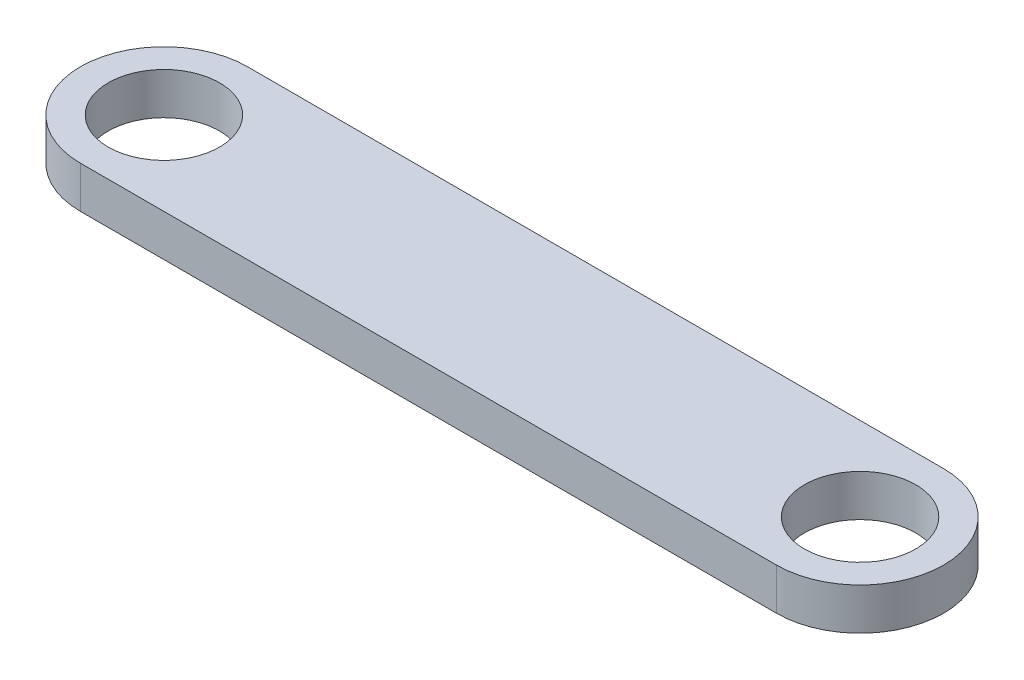
ISO-10303-21;
HEADER;
FILE_DESCRIPTION(('STEP AP214'),'2;1');
FILE_NAME('part.step','',(''),(''),'','','');
FILE_SCHEMA(('AUTOMOTIVE_DESIGN { 1 0 10303 214 1 1 1 1 }'));
ENDSEC;
DATA;
#1=APPLICATION_CONTEXT('core data for automotive mechanical design processes');
#2=APPLICATION_PROTOCOL_DEFINITION('international standard','automotive_design',2000,#1);
#3=PRODUCT_CONTEXT('',#1,'mechanical');
#4=PRODUCT('Part','Part','',(#3));
#5=PRODUCT_RELATED_PRODUCT_CATEGORY('part','',(#4));
#6=PRODUCT_DEFINITION_FORMATION('','',#4);
#7=PRODUCT_DEFINITION_CONTEXT('part definition',#1,'design');
#8=PRODUCT_DEFINITION('design','',#6,#7);
#9=PRODUCT_DEFINITION_SHAPE('','',#8);
#10=(LENGTH_UNIT() NAMED_UNIT(*) SI_UNIT(.MILLI.,.METRE.));
#11=(NAMED_UNIT(*) PLANE_ANGLE_UNIT() SI_UNIT($,.RADIAN.));
#12=(NAMED_UNIT(*) SI_UNIT($,.STERADIAN.) SOLID_ANGLE_UNIT());
#13=UNCERTAINTY_MEASURE_WITH_UNIT(LENGTH_MEASURE(1.E-05),#10,'distance_accuracy_value','');
#14=(GEOMETRIC_REPRESENTATION_CONTEXT(3) GLOBAL_UNCERTAINTY_ASSIGNED_CONTEXT((#13)) GLOBAL_UNIT_ASSIGNED_CONTEXT((#10,
#11,#12)) REPRESENTATION_CONTEXT('',''));
#15=CARTESIAN_POINT('',(0.,0.,0.));
#16=DIRECTION('',(0.,0.,1.));
#17=DIRECTION('',(1.,0.,0.));
#18=AXIS2_PLACEMENT_3D('',#15,#16,#17);
#19=CARTESIAN_POINT('',(-40.1246369495546,3.,-0.124636949554571));
#20=DIRECTION('',(0.,1.,0.));
#21=DIRECTION('',(0.,0.,1.));
#22=AXIS2_PLACEMENT_3D('',#19,#20,#21);
#23=PLANE('',#22);
#24=CARTESIAN_POINT('',(-40.1246369495546,3.,-0.124636949554571));
#25=DIRECTION('',(0.,1.,0.));
#26=DIRECTION('',(0.,0.,1.));
#27=AXIS2_PLACEMENT_3D('',#24,#25,#26);
#28=CIRCLE('',#27,4.);
#29=CARTESIAN_POINT('',(-40.1246369495546,3.,3.87536305044543));
#30=VERTEX_POINT('',#29);
#31=EDGE_CURVE('E104',#30,#30,#28,.T.);
#32=ORIENTED_EDGE('',*,*,#31,.F.);
#33=EDGE_LOOP('',(#32));
#34=FACE_BOUND('',#33,.T.);
#35=CARTESIAN_POINT('',(-40.1246369495546,3.,-0.124636949554571));
#36=DIRECTION('',(0.,1.,0.));
#37=DIRECTION('',(0.,0.,1.));
#38=AXIS2_PLACEMENT_3D('',#35,#36,#37);
#39=CIRCLE('',#38,6.);
#40=CARTESIAN_POINT('',(-40.1246369495546,3.,-6.12463694955457));
#41=VERTEX_POINT('',#40);
#42=CARTESIAN_POINT('',(-40.1246369495546,3.,5.87536305044543));
#43=VERTEX_POINT('',#42);
#44=EDGE_CURVE('E89',#41,#43,#39,.T.);
#45=ORIENTED_EDGE('',*,*,#44,.T.);
#46=DIRECTION('',(1.,0.,0.));
#47=VECTOR('',#46,1.);
#48=CARTESIAN_POINT('',(-40.1246369495546,3.,5.87536305044543));
#49=LINE('',#48,#47);
#50=CARTESIAN_POINT('',(9.87536305044545,3.,5.87536305044543));
#51=VERTEX_POINT('',#50);
#52=EDGE_CURVE('E84',#43,#51,#49,.T.);
#53=ORIENTED_EDGE('',*,*,#52,.T.);
#54=CARTESIAN_POINT('',(9.87536305044545,3.,-0.124636949554571));
#55=DIRECTION('',(0.,1.,0.));
#56=DIRECTION('',(0.,0.,1.));
#57=AXIS2_PLACEMENT_3D('',#54,#55,#56);
#58=CIRCLE('',#57,6.00000000000001);
#59=CARTESIAN_POINT('',(9.87536305044545,3.,-6.12463694955458));
#60=VERTEX_POINT('',#59);
#61=EDGE_CURVE('E87',#51,#60,#58,.T.);
#62=ORIENTED_EDGE('',*,*,#61,.T.);
#63=DIRECTION('',(-1.,0.,0.));
#64=VECTOR('',#63,1.);
#65=CARTESIAN_POINT('',(-40.1246369495546,3.,-6.12463694955457));
#66=LINE('',#65,#64);
#67=EDGE_CURVE('E54',#60,#41,#66,.T.);
#68=ORIENTED_EDGE('',*,*,#67,.T.);
#69=EDGE_LOOP('',(#45,#53,#62,#68));
#70=FACE_BOUND('',#69,.T.);
#71=CARTESIAN_POINT('',(9.87536305044545,3.,-0.124636949554571));
#72=DIRECTION('',(0.,1.,0.));
#73=DIRECTION('',(0.,0.,1.));
#74=AXIS2_PLACEMENT_3D('',#71,#72,#73);
#75=CIRCLE('',#74,4.00000000000001);
#76=CARTESIAN_POINT('',(9.87536305044545,3.,3.87536305044544));
#77=VERTEX_POINT('',#76);
#78=EDGE_CURVE('E119',#77,#77,#75,.T.);
#79=ORIENTED_EDGE('',*,*,#78,.F.);
#80=EDGE_LOOP('',(#79));
#81=FACE_BOUND('',#80,.T.);
#82=ADVANCED_FACE('F37',(#34,#70,#81),#23,.T.);
#83=CARTESIAN_POINT('',(-40.1246369495546,0.,-0.124636949554571));
#84=DIRECTION('',(0.,1.,0.));
#85=DIRECTION('',(0.,0.,1.));
#86=AXIS2_PLACEMENT_3D('',#83,#84,#85);
#87=PLANE('',#86);
#88=CARTESIAN_POINT('',(-40.1246369495546,0.,-0.124636949554571));
#89=DIRECTION('',(0.,1.,0.));
#90=DIRECTION('',(0.,0.,1.));
#91=AXIS2_PLACEMENT_3D('',#88,#89,#90);
#92=CIRCLE('',#91,6.);
#93=CARTESIAN_POINT('',(-40.1246369495546,0.,-6.12463694955457));
#94=VERTEX_POINT('',#93);
#95=CARTESIAN_POINT('',(-40.1246369495546,0.,5.87536305044543));
#96=VERTEX_POINT('',#95);
#97=EDGE_CURVE('E101',#94,#96,#92,.T.);
#98=ORIENTED_EDGE('',*,*,#97,.F.);
#99=DIRECTION('',(-1.,0.,0.));
#100=VECTOR('',#99,1.);
#101=CARTESIAN_POINT('',(-40.1246369495546,0.,-6.12463694955457));
#102=LINE('',#101,#100);
#103=CARTESIAN_POINT('',(9.87536305044545,0.,-6.12463694955458));
#104=VERTEX_POINT('',#103);
#105=EDGE_CURVE('E77',#104,#94,#102,.T.);
#106=ORIENTED_EDGE('',*,*,#105,.F.);
#107=CARTESIAN_POINT('',(9.87536305044545,0.,-0.124636949554571));
#108=DIRECTION('',(0.,1.,0.));
#109=DIRECTION('',(0.,0.,1.));
#110=AXIS2_PLACEMENT_3D('',#107,#108,#109);
#111=CIRCLE('',#110,6.00000000000001);
#112=CARTESIAN_POINT('',(9.87536305044545,0.,5.87536305044543));
#113=VERTEX_POINT('',#112);
#114=EDGE_CURVE('E71',#113,#104,#111,.T.);
#115=ORIENTED_EDGE('',*,*,#114,.F.);
#116=DIRECTION('',(1.,0.,0.));
#117=VECTOR('',#116,1.);
#118=CARTESIAN_POINT('',(-40.1246369495546,0.,5.87536305044543));
#119=LINE('',#118,#117);
#120=EDGE_CURVE('E93',#96,#113,#119,.T.);
#121=ORIENTED_EDGE('',*,*,#120,.F.);
#122=EDGE_LOOP('',(#98,#106,#115,#121));
#123=FACE_BOUND('',#122,.T.);
#124=CARTESIAN_POINT('',(-40.1246369495546,0.,-0.124636949554571));
#125=DIRECTION('',(0.,1.,0.));
#126=DIRECTION('',(0.,0.,1.));
#127=AXIS2_PLACEMENT_3D('',#124,#125,#126);
#128=CIRCLE('',#127,4.);
#129=CARTESIAN_POINT('',(-40.1246369495546,0.,3.87536305044543));
#130=VERTEX_POINT('',#129);
#131=EDGE_CURVE('E116',#130,#130,#128,.T.);
#132=ORIENTED_EDGE('',*,*,#131,.T.);
#133=EDGE_LOOP('',(#132));
#134=FACE_BOUND('',#133,.T.);
#135=CARTESIAN_POINT('',(9.87536305044545,0.,-0.124636949554571));
#136=DIRECTION('',(0.,1.,0.));
#137=DIRECTION('',(0.,0.,1.));
#138=AXIS2_PLACEMENT_3D('',#135,#136,#137);
#139=CIRCLE('',#138,4.00000000000001);
#140=CARTESIAN_POINT('',(9.87536305044545,0.,3.87536305044544));
#141=VERTEX_POINT('',#140);
#142=EDGE_CURVE('E122',#141,#141,#139,.T.);
#143=ORIENTED_EDGE('',*,*,#142,.T.);
#144=EDGE_LOOP('',(#143));
#145=FACE_BOUND('',#144,.T.);
#146=ADVANCED_FACE('F112',(#123,#134,#145),#87,.F.);
#147=CARTESIAN_POINT('',(-40.1246369495546,3.,-0.124636949554571));
#148=DIRECTION('',(0.,-1.,0.));
#149=DIRECTION('',(0.,0.,-1.));
#150=AXIS2_PLACEMENT_3D('',#147,#148,#149);
#151=CYLINDRICAL_SURFACE('',#150,6.);
#152=ORIENTED_EDGE('',*,*,#97,.T.);
#153=DIRECTION('',(0.,-1.,0.));
#154=VECTOR('',#153,1.);
#155=CARTESIAN_POINT('',(-40.1246369495546,3.,5.87536305044543));
#156=LINE('',#155,#154);
#157=EDGE_CURVE('E11',#43,#96,#156,.T.);
#158=ORIENTED_EDGE('',*,*,#157,.F.);
#159=ORIENTED_EDGE('',*,*,#44,.F.);
#160=DIRECTION('',(0.,-1.,0.));
#161=VECTOR('',#160,1.);
#162=CARTESIAN_POINT('',(-40.1246369495546,3.,-6.12463694955457));
#163=LINE('',#162,#161);
#164=EDGE_CURVE('E97',#41,#94,#163,.T.);
#165=ORIENTED_EDGE('',*,*,#164,.T.);
#166=EDGE_LOOP('',(#152,#158,#159,#165));
#167=FACE_BOUND('',#166,.T.);
#168=ADVANCED_FACE('F39',(#167),#151,.T.);
#169=CARTESIAN_POINT('',(-40.1246369495546,3.,5.87536305044543));
#170=DIRECTION('',(0.,0.,-1.));
#171=DIRECTION('',(-1.,0.,0.));
#172=AXIS2_PLACEMENT_3D('',#169,#170,#171);
#173=PLANE('',#172);
#174=ORIENTED_EDGE('',*,*,#120,.T.);
#175=DIRECTION('',(0.,-1.,0.));
#176=VECTOR('',#175,1.);
#177=CARTESIAN_POINT('',(9.87536305044545,3.,5.87536305044543));
#178=LINE('',#177,#176);
#179=EDGE_CURVE('E46',#51,#113,#178,.T.);
#180=ORIENTED_EDGE('',*,*,#179,.F.);
#181=ORIENTED_EDGE('',*,*,#52,.F.);
#182=ORIENTED_EDGE('',*,*,#157,.T.);
#183=EDGE_LOOP('',(#174,#180,#181,#182));
#184=FACE_BOUND('',#183,.T.);
#185=ADVANCED_FACE('F92',(#184),#173,.F.);
#186=CARTESIAN_POINT('',(9.87536305044545,3.,-0.124636949554571));
#187=DIRECTION('',(0.,-1.,0.));
#188=DIRECTION('',(0.,0.,-1.));
#189=AXIS2_PLACEMENT_3D('',#186,#187,#188);
#190=CYLINDRICAL_SURFACE('',#189,6.00000000000001);
#191=ORIENTED_EDGE('',*,*,#114,.T.);
#192=DIRECTION('',(0.,-1.,0.));
#193=VECTOR('',#192,1.);
#194=CARTESIAN_POINT('',(9.87536305044545,3.,-6.12463694955458));
#195=LINE('',#194,#193);
#196=EDGE_CURVE('E94',#60,#104,#195,.T.);
#197=ORIENTED_EDGE('',*,*,#196,.F.);
#198=ORIENTED_EDGE('',*,*,#61,.F.);
#199=ORIENTED_EDGE('',*,*,#179,.T.);
#200=EDGE_LOOP('',(#191,#197,#198,#199));
#201=FACE_BOUND('',#200,.T.);
#202=ADVANCED_FACE('F95',(#201),#190,.T.);
#203=CARTESIAN_POINT('',(-40.1246369495546,3.,-6.12463694955457));
#204=DIRECTION('',(0.,0.,1.));
#205=DIRECTION('',(1.,0.,0.));
#206=AXIS2_PLACEMENT_3D('',#203,#204,#205);
#207=PLANE('',#206);
#208=ORIENTED_EDGE('',*,*,#105,.T.);
#209=ORIENTED_EDGE('',*,*,#164,.F.);
#210=ORIENTED_EDGE('',*,*,#67,.F.);
#211=ORIENTED_EDGE('',*,*,#196,.T.);
#212=EDGE_LOOP('',(#208,#209,#210,#211));
#213=FACE_BOUND('',#212,.T.);
#214=ADVANCED_FACE('F109',(#213),#207,.F.);
#215=CARTESIAN_POINT('',(-40.1246369495546,3.,-0.124636949554571));
#216=DIRECTION('',(0.,-1.,0.));
#217=DIRECTION('',(0.,0.,-1.));
#218=AXIS2_PLACEMENT_3D('',#215,#216,#217);
#219=CYLINDRICAL_SURFACE('',#218,4.);
#220=ORIENTED_EDGE('',*,*,#31,.T.);
#221=EDGE_LOOP('',(#220));
#222=FACE_BOUND('',#221,.T.);
#223=ORIENTED_EDGE('',*,*,#131,.F.);
#224=EDGE_LOOP('',(#223));
#225=FACE_BOUND('',#224,.T.);
#226=ADVANCED_FACE('F139',(#222,#225),#219,.F.);
#227=CARTESIAN_POINT('',(9.87536305044545,3.,-0.124636949554571));
#228=DIRECTION('',(0.,-1.,0.));
#229=DIRECTION('',(0.,0.,-1.));
#230=AXIS2_PLACEMENT_3D('',#227,#228,#229);
#231=CYLINDRICAL_SURFACE('',#230,4.00000000000001);
#232=ORIENTED_EDGE('',*,*,#78,.T.);
#233=EDGE_LOOP('',(#232));
#234=FACE_BOUND('',#233,.T.);
#235=ORIENTED_EDGE('',*,*,#142,.F.);
#236=EDGE_LOOP('',(#235));
#237=FACE_BOUND('',#236,.T.);
#238=ADVANCED_FACE('F128',(#234,#237),#231,.F.);
#239=CLOSED_SHELL('',(#82,#146,#168,#185,#202,#214,#226,#238));
#240=MANIFOLD_SOLID_BREP('B2',#239);
#241=ADVANCED_BREP_SHAPE_REPRESENTATION('',(#18,#240),#14);
#242=SHAPE_DEFINITION_REPRESENTATION(#9,#241);
ENDSEC;
END-ISO-10303-21;
